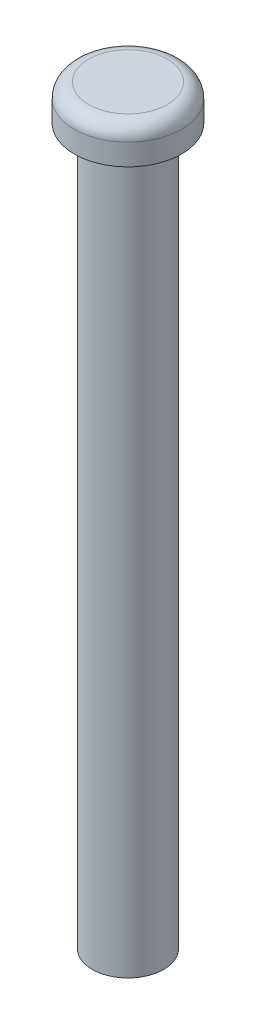
ISO-10303-21;
HEADER;
FILE_DESCRIPTION(('STEP AP214'),'2;1');
FILE_NAME('part.step','',(''),(''),'','','');
FILE_SCHEMA(('AUTOMOTIVE_DESIGN { 1 0 10303 214 1 1 1 1 }'));
ENDSEC;
DATA;
#1=APPLICATION_CONTEXT('core data for automotive mechanical design processes');
#2=APPLICATION_PROTOCOL_DEFINITION('international standard','automotive_design',2000,#1);
#3=PRODUCT_CONTEXT('',#1,'mechanical');
#4=PRODUCT('Part','Part','',(#3));
#5=PRODUCT_RELATED_PRODUCT_CATEGORY('part','',(#4));
#6=PRODUCT_DEFINITION_FORMATION('','',#4);
#7=PRODUCT_DEFINITION_CONTEXT('part definition',#1,'design');
#8=PRODUCT_DEFINITION('design','',#6,#7);
#9=PRODUCT_DEFINITION_SHAPE('','',#8);
#10=(LENGTH_UNIT() NAMED_UNIT(*) SI_UNIT(.MILLI.,.METRE.));
#11=(NAMED_UNIT(*) PLANE_ANGLE_UNIT() SI_UNIT($,.RADIAN.));
#12=(NAMED_UNIT(*) SI_UNIT($,.STERADIAN.) SOLID_ANGLE_UNIT());
#13=UNCERTAINTY_MEASURE_WITH_UNIT(LENGTH_MEASURE(1.E-05),#10,'distance_accuracy_value','');
#14=(GEOMETRIC_REPRESENTATION_CONTEXT(3) GLOBAL_UNCERTAINTY_ASSIGNED_CONTEXT((#13)) GLOBAL_UNIT_ASSIGNED_CONTEXT((#10,
#11,#12)) REPRESENTATION_CONTEXT('',''));
#15=CARTESIAN_POINT('',(0.,0.,0.));
#16=DIRECTION('',(0.,0.,1.));
#17=DIRECTION('',(1.,0.,0.));
#18=AXIS2_PLACEMENT_3D('',#15,#16,#17);
#19=CARTESIAN_POINT('',(0.,100.,0.));
#20=DIRECTION('',(0.,-1.,0.));
#21=DIRECTION('',(0.,0.,-1.));
#22=AXIS2_PLACEMENT_3D('',#19,#20,#21);
#23=CYLINDRICAL_SURFACE('',#22,5.);
#24=CARTESIAN_POINT('',(0.,100.,0.));
#25=DIRECTION('',(0.,1.,0.));
#26=DIRECTION('',(0.,0.,1.));
#27=AXIS2_PLACEMENT_3D('',#24,#25,#26);
#28=CIRCLE('',#27,5.);
#29=CARTESIAN_POINT('',(0.,100.,5.));
#30=VERTEX_POINT('',#29);
#31=EDGE_CURVE('E56',#30,#30,#28,.T.);
#32=ORIENTED_EDGE('',*,*,#31,.F.);
#33=EDGE_LOOP('',(#32));
#34=FACE_BOUND('',#33,.T.);
#35=CARTESIAN_POINT('',(0.,0.,0.));
#36=DIRECTION('',(0.,1.,0.));
#37=DIRECTION('',(0.,0.,1.));
#38=AXIS2_PLACEMENT_3D('',#35,#36,#37);
#39=CIRCLE('',#38,5.);
#40=CARTESIAN_POINT('',(0.,0.,5.));
#41=VERTEX_POINT('',#40);
#42=EDGE_CURVE('E61',#41,#41,#39,.T.);
#43=ORIENTED_EDGE('',*,*,#42,.T.);
#44=EDGE_LOOP('',(#43));
#45=FACE_BOUND('',#44,.T.);
#46=ADVANCED_FACE('F43',(#34,#45),#23,.T.);
#47=CARTESIAN_POINT('',(0.,0.,0.));
#48=DIRECTION('',(0.,1.,0.));
#49=DIRECTION('',(0.,0.,1.));
#50=AXIS2_PLACEMENT_3D('',#47,#48,#49);
#51=PLANE('',#50);
#52=ORIENTED_EDGE('',*,*,#42,.F.);
#53=EDGE_LOOP('',(#52));
#54=FACE_BOUND('',#53,.T.);
#55=ADVANCED_FACE('F89',(#54),#51,.F.);
#56=CARTESIAN_POINT('',(0.,105.,0.));
#57=DIRECTION('',(0.,-1.,0.));
#58=DIRECTION('',(0.,0.,-1.));
#59=AXIS2_PLACEMENT_3D('',#56,#57,#58);
#60=CYLINDRICAL_SURFACE('',#59,7.5);
#61=CARTESIAN_POINT('',(0.,103.,0.));
#62=DIRECTION('',(0.,1.,0.));
#63=DIRECTION('',(0.,0.,1.));
#64=AXIS2_PLACEMENT_3D('',#61,#62,#63);
#65=CIRCLE('',#64,7.5);
#66=CARTESIAN_POINT('',(0.,103.,7.5));
#67=VERTEX_POINT('',#66);
#68=EDGE_CURVE('E10',#67,#67,#65,.F.);
#69=ORIENTED_EDGE('',*,*,#68,.T.);
#70=EDGE_LOOP('',(#69));
#71=FACE_BOUND('',#70,.T.);
#72=CARTESIAN_POINT('',(0.,100.,0.));
#73=DIRECTION('',(0.,1.,0.));
#74=DIRECTION('',(0.,0.,1.));
#75=AXIS2_PLACEMENT_3D('',#72,#73,#74);
#76=CIRCLE('',#75,7.5);
#77=CARTESIAN_POINT('',(0.,100.,7.5));
#78=VERTEX_POINT('',#77);
#79=EDGE_CURVE('E66',#78,#78,#76,.T.);
#80=ORIENTED_EDGE('',*,*,#79,.T.);
#81=EDGE_LOOP('',(#80));
#82=FACE_BOUND('',#81,.T.);
#83=ADVANCED_FACE('F72',(#71,#82),#60,.T.);
#84=CARTESIAN_POINT('',(0.,105.,0.));
#85=DIRECTION('',(0.,1.,0.));
#86=DIRECTION('',(0.,0.,1.));
#87=AXIS2_PLACEMENT_3D('',#84,#85,#86);
#88=PLANE('',#87);
#89=CARTESIAN_POINT('',(0.,105.,0.));
#90=DIRECTION('',(0.,1.,0.));
#91=DIRECTION('',(0.,0.,1.));
#92=AXIS2_PLACEMENT_3D('',#89,#90,#91);
#93=CIRCLE('',#92,5.5);
#94=CARTESIAN_POINT('',(0.,105.,5.5));
#95=VERTEX_POINT('',#94);
#96=EDGE_CURVE('E51',#95,#95,#93,.T.);
#97=ORIENTED_EDGE('',*,*,#96,.T.);
#98=EDGE_LOOP('',(#97));
#99=FACE_BOUND('',#98,.T.);
#100=ADVANCED_FACE('F76',(#99),#88,.T.);
#101=CARTESIAN_POINT('',(0.,100.,0.));
#102=DIRECTION('',(0.,1.,0.));
#103=DIRECTION('',(0.,0.,1.));
#104=AXIS2_PLACEMENT_3D('',#101,#102,#103);
#105=PLANE('',#104);
#106=ORIENTED_EDGE('',*,*,#31,.T.);
#107=EDGE_LOOP('',(#106));
#108=FACE_BOUND('',#107,.T.);
#109=ORIENTED_EDGE('',*,*,#79,.F.);
#110=EDGE_LOOP('',(#109));
#111=FACE_BOUND('',#110,.T.);
#112=ADVANCED_FACE('F74',(#108,#111),#105,.F.);
#113=CARTESIAN_POINT('',(0.,103.,0.));
#114=DIRECTION('',(0.,1.,0.));
#115=DIRECTION('',(0.,0.,1.));
#116=AXIS2_PLACEMENT_3D('',#113,#114,#115);
#117=TOROIDAL_SURFACE('',#116,5.5,2.);
#118=ORIENTED_EDGE('',*,*,#68,.F.);
#119=EDGE_LOOP('',(#118));
#120=FACE_BOUND('',#119,.T.);
#121=ORIENTED_EDGE('',*,*,#96,.F.);
#122=EDGE_LOOP('',(#121));
#123=FACE_BOUND('',#122,.T.);
#124=ADVANCED_FACE('F45',(#120,#123),#117,.T.);
#125=CLOSED_SHELL('',(#46,#55,#83,#100,#112,#124));
#126=MANIFOLD_SOLID_BREP('B2',#125);
#127=ADVANCED_BREP_SHAPE_REPRESENTATION('',(#18,#126),#14);
#128=SHAPE_DEFINITION_REPRESENTATION(#9,#127);
ENDSEC;
END-ISO-10303-21;
